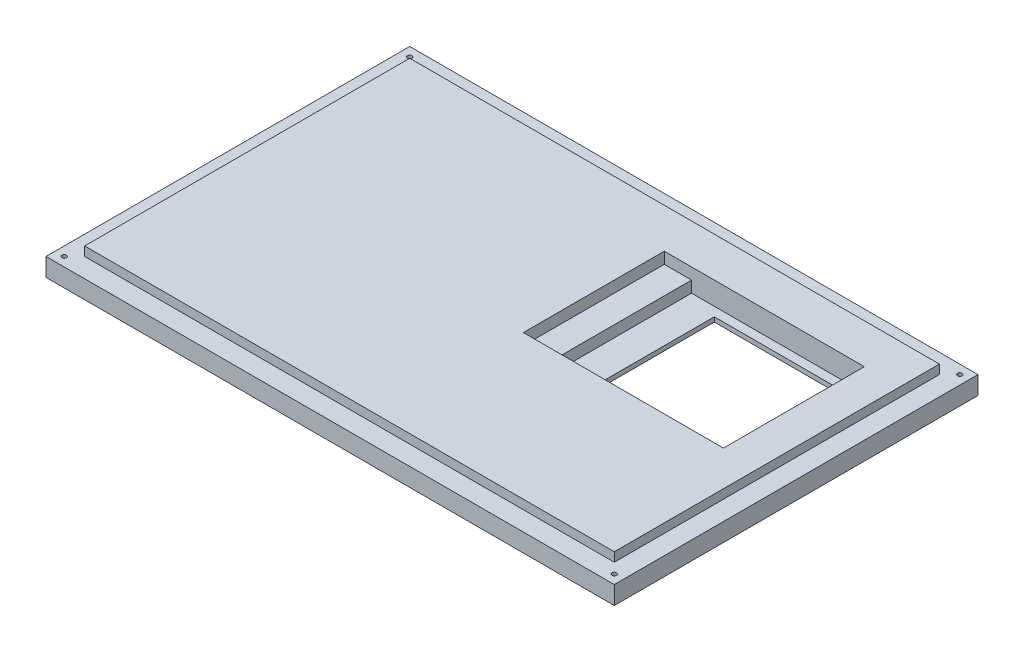
ISO-10303-21;
HEADER;
FILE_DESCRIPTION(('STEP AP214'),'2;1');
FILE_NAME('part.step','',(''),(''),'','','');
FILE_SCHEMA(('AUTOMOTIVE_DESIGN { 1 0 10303 214 1 1 1 1 }'));
ENDSEC;
DATA;
#1=APPLICATION_CONTEXT('core data for automotive mechanical design processes');
#2=APPLICATION_PROTOCOL_DEFINITION('international standard','automotive_design',2000,#1);
#3=PRODUCT_CONTEXT('',#1,'mechanical');
#4=PRODUCT('Part','Part','',(#3));
#5=PRODUCT_RELATED_PRODUCT_CATEGORY('part','',(#4));
#6=PRODUCT_DEFINITION_FORMATION('','',#4);
#7=PRODUCT_DEFINITION_CONTEXT('part definition',#1,'design');
#8=PRODUCT_DEFINITION('design','',#6,#7);
#9=PRODUCT_DEFINITION_SHAPE('','',#8);
#10=(LENGTH_UNIT() NAMED_UNIT(*) SI_UNIT(.MILLI.,.METRE.));
#11=(NAMED_UNIT(*) PLANE_ANGLE_UNIT() SI_UNIT($,.RADIAN.));
#12=(NAMED_UNIT(*) SI_UNIT($,.STERADIAN.) SOLID_ANGLE_UNIT());
#13=UNCERTAINTY_MEASURE_WITH_UNIT(LENGTH_MEASURE(1.E-05),#10,'distance_accuracy_value','');
#14=(GEOMETRIC_REPRESENTATION_CONTEXT(3) GLOBAL_UNCERTAINTY_ASSIGNED_CONTEXT((#13)) GLOBAL_UNIT_ASSIGNED_CONTEXT((#10,
#11,#12)) REPRESENTATION_CONTEXT('',''));
#15=CARTESIAN_POINT('',(0.,0.,0.));
#16=DIRECTION('',(0.,0.,1.));
#17=DIRECTION('',(1.,0.,0.));
#18=AXIS2_PLACEMENT_3D('',#15,#16,#17);
#19=CARTESIAN_POINT('',(82.,-6.,-65.));
#20=DIRECTION('',(-1.,0.,0.));
#21=DIRECTION('',(0.,0.,1.));
#22=AXIS2_PLACEMENT_3D('',#19,#20,#21);
#23=PLANE('',#22);
#24=DIRECTION('',(0.,1.,0.));
#25=VECTOR('',#24,1.);
#26=CARTESIAN_POINT('',(82.,-6.,-65.));
#27=LINE('',#26,#25);
#28=CARTESIAN_POINT('',(82.,0.,-65.));
#29=VERTEX_POINT('',#28);
#30=CARTESIAN_POINT('',(82.,1.,-65.));
#31=VERTEX_POINT('',#30);
#32=EDGE_CURVE('E233',#29,#31,#27,.T.);
#33=ORIENTED_EDGE('',*,*,#32,.T.);
#34=DIRECTION('',(0.,0.,1.));
#35=VECTOR('',#34,1.);
#36=CARTESIAN_POINT('',(82.,1.,-65.));
#37=LINE('',#36,#35);
#38=CARTESIAN_POINT('',(82.,1.,-38.));
#39=VERTEX_POINT('',#38);
#40=EDGE_CURVE('E211',#31,#39,#37,.T.);
#41=ORIENTED_EDGE('',*,*,#40,.T.);
#42=DIRECTION('',(0.,1.,0.));
#43=VECTOR('',#42,1.);
#44=CARTESIAN_POINT('',(82.,-6.,-38.));
#45=LINE('',#44,#43);
#46=CARTESIAN_POINT('',(82.,0.,-38.));
#47=VERTEX_POINT('',#46);
#48=EDGE_CURVE('E229',#47,#39,#45,.T.);
#49=ORIENTED_EDGE('',*,*,#48,.F.);
#50=DIRECTION('',(0.,0.,-1.));
#51=VECTOR('',#50,1.);
#52=CARTESIAN_POINT('',(82.,0.,0.));
#53=LINE('',#52,#51);
#54=EDGE_CURVE('E251',#47,#29,#53,.T.);
#55=ORIENTED_EDGE('',*,*,#54,.T.);
#56=EDGE_LOOP('',(#33,#41,#49,#55));
#57=FACE_BOUND('',#56,.T.);
#58=ADVANCED_FACE('F40',(#57),#23,.F.);
#59=CARTESIAN_POINT('',(82.,-6.,-65.));
#60=DIRECTION('',(0.,0.,-1.));
#61=DIRECTION('',(-1.,0.,0.));
#62=AXIS2_PLACEMENT_3D('',#59,#60,#61);
#63=PLANE('',#62);
#64=DIRECTION('',(0.,1.,0.));
#65=VECTOR('',#64,1.);
#66=CARTESIAN_POINT('',(110.,-6.,-65.));
#67=LINE('',#66,#65);
#68=CARTESIAN_POINT('',(110.,0.,-65.));
#69=VERTEX_POINT('',#68);
#70=CARTESIAN_POINT('',(110.,1.,-65.));
#71=VERTEX_POINT('',#70);
#72=EDGE_CURVE('E237',#69,#71,#67,.T.);
#73=ORIENTED_EDGE('',*,*,#72,.T.);
#74=DIRECTION('',(-1.,0.,0.));
#75=VECTOR('',#74,1.);
#76=CARTESIAN_POINT('',(82.,1.,-65.));
#77=LINE('',#76,#75);
#78=EDGE_CURVE('E208',#71,#31,#77,.T.);
#79=ORIENTED_EDGE('',*,*,#78,.T.);
#80=ORIENTED_EDGE('',*,*,#32,.F.);
#81=DIRECTION('',(1.,0.,0.));
#82=VECTOR('',#81,1.);
#83=CARTESIAN_POINT('',(0.,0.,-65.));
#84=LINE('',#83,#82);
#85=EDGE_CURVE('E249',#29,#69,#84,.T.);
#86=ORIENTED_EDGE('',*,*,#85,.T.);
#87=EDGE_LOOP('',(#73,#79,#80,#86));
#88=FACE_BOUND('',#87,.T.);
#89=ADVANCED_FACE('F365',(#88),#63,.F.);
#90=CARTESIAN_POINT('',(110.,-6.,-65.));
#91=DIRECTION('',(1.,0.,0.));
#92=DIRECTION('',(0.,0.,-1.));
#93=AXIS2_PLACEMENT_3D('',#90,#91,#92);
#94=PLANE('',#93);
#95=DIRECTION('',(0.,1.,0.));
#96=VECTOR('',#95,1.);
#97=CARTESIAN_POINT('',(110.,-6.,-38.));
#98=LINE('',#97,#96);
#99=CARTESIAN_POINT('',(110.,0.,-38.));
#100=VERTEX_POINT('',#99);
#101=CARTESIAN_POINT('',(110.,1.,-38.));
#102=VERTEX_POINT('',#101);
#103=EDGE_CURVE('E240',#100,#102,#98,.T.);
#104=ORIENTED_EDGE('',*,*,#103,.T.);
#105=DIRECTION('',(0.,0.,-1.));
#106=VECTOR('',#105,1.);
#107=CARTESIAN_POINT('',(110.,1.,-65.));
#108=LINE('',#107,#106);
#109=EDGE_CURVE('E55',#102,#71,#108,.T.);
#110=ORIENTED_EDGE('',*,*,#109,.T.);
#111=ORIENTED_EDGE('',*,*,#72,.F.);
#112=DIRECTION('',(0.,0.,1.));
#113=VECTOR('',#112,1.);
#114=CARTESIAN_POINT('',(110.,0.,0.));
#115=LINE('',#114,#113);
#116=EDGE_CURVE('E246',#69,#100,#115,.T.);
#117=ORIENTED_EDGE('',*,*,#116,.T.);
#118=EDGE_LOOP('',(#104,#110,#111,#117));
#119=FACE_BOUND('',#118,.T.);
#120=ADVANCED_FACE('F371',(#119),#94,.F.);
#121=CARTESIAN_POINT('',(82.,-6.,-38.));
#122=DIRECTION('',(0.,0.,1.));
#123=DIRECTION('',(1.,0.,0.));
#124=AXIS2_PLACEMENT_3D('',#121,#122,#123);
#125=PLANE('',#124);
#126=ORIENTED_EDGE('',*,*,#48,.T.);
#127=DIRECTION('',(1.,0.,0.));
#128=VECTOR('',#127,1.);
#129=CARTESIAN_POINT('',(82.,1.,-38.));
#130=LINE('',#129,#128);
#131=EDGE_CURVE('E12',#39,#102,#130,.T.);
#132=ORIENTED_EDGE('',*,*,#131,.T.);
#133=ORIENTED_EDGE('',*,*,#103,.F.);
#134=DIRECTION('',(-1.,0.,0.));
#135=VECTOR('',#134,1.);
#136=CARTESIAN_POINT('',(0.,0.,-38.));
#137=LINE('',#136,#135);
#138=EDGE_CURVE('E236',#100,#47,#137,.T.);
#139=ORIENTED_EDGE('',*,*,#138,.T.);
#140=EDGE_LOOP('',(#126,#132,#133,#139));
#141=FACE_BOUND('',#140,.T.);
#142=ADVANCED_FACE('F336',(#141),#125,.F.);
#143=CARTESIAN_POINT('',(0.,4.,0.));
#144=DIRECTION('',(0.,-1.,0.));
#145=DIRECTION('',(0.,0.,-1.));
#146=AXIS2_PLACEMENT_3D('',#143,#144,#145);
#147=PLANE('',#146);
#148=CARTESIAN_POINT('',(123.,4.,-78.));
#149=DIRECTION('',(0.,-1.,0.));
#150=DIRECTION('',(0.,0.,-1.));
#151=AXIS2_PLACEMENT_3D('',#148,#149,#150);
#152=CIRCLE('',#151,0.5);
#153=CARTESIAN_POINT('',(123.,4.,-78.5));
#154=VERTEX_POINT('',#153);
#155=EDGE_CURVE('E676',#154,#154,#152,.T.);
#156=ORIENTED_EDGE('',*,*,#155,.T.);
#157=EDGE_LOOP('',(#156));
#158=FACE_BOUND('',#157,.T.);
#159=CARTESIAN_POINT('',(123.,4.,-2.));
#160=DIRECTION('',(0.,-1.,0.));
#161=DIRECTION('',(0.,0.,-1.));
#162=AXIS2_PLACEMENT_3D('',#159,#160,#161);
#163=CIRCLE('',#162,0.5);
#164=CARTESIAN_POINT('',(123.,4.,-2.5));
#165=VERTEX_POINT('',#164);
#166=EDGE_CURVE('E672',#165,#165,#163,.T.);
#167=ORIENTED_EDGE('',*,*,#166,.T.);
#168=EDGE_LOOP('',(#167));
#169=FACE_BOUND('',#168,.T.);
#170=CARTESIAN_POINT('',(2.,4.,-2.));
#171=DIRECTION('',(0.,-1.,0.));
#172=DIRECTION('',(0.,0.,-1.));
#173=AXIS2_PLACEMENT_3D('',#170,#171,#172);
#174=CIRCLE('',#173,0.499999999999999);
#175=CARTESIAN_POINT('',(2.,4.,-2.5));
#176=VERTEX_POINT('',#175);
#177=EDGE_CURVE('E667',#176,#176,#174,.T.);
#178=ORIENTED_EDGE('',*,*,#177,.T.);
#179=EDGE_LOOP('',(#178));
#180=FACE_BOUND('',#179,.T.);
#181=CARTESIAN_POINT('',(2.,4.,-78.));
#182=DIRECTION('',(0.,-1.,0.));
#183=DIRECTION('',(0.,0.,-1.));
#184=AXIS2_PLACEMENT_3D('',#181,#182,#183);
#185=CIRCLE('',#184,0.499999999999999);
#186=CARTESIAN_POINT('',(2.,4.,-78.5));
#187=VERTEX_POINT('',#186);
#188=EDGE_CURVE('E192',#187,#187,#185,.T.);
#189=ORIENTED_EDGE('',*,*,#188,.T.);
#190=EDGE_LOOP('',(#189));
#191=FACE_BOUND('',#190,.T.);
#192=DIRECTION('',(0.,0.,1.));
#193=VECTOR('',#192,1.);
#194=CARTESIAN_POINT('',(0.,4.,0.));
#195=LINE('',#194,#193);
#196=CARTESIAN_POINT('',(0.,4.,-80.));
#197=VERTEX_POINT('',#196);
#198=CARTESIAN_POINT('',(0.,4.,0.));
#199=VERTEX_POINT('',#198);
#200=EDGE_CURVE('E287',#197,#199,#195,.T.);
#201=ORIENTED_EDGE('',*,*,#200,.T.);
#202=DIRECTION('',(1.,0.,0.));
#203=VECTOR('',#202,1.);
#204=CARTESIAN_POINT('',(0.,4.,0.));
#205=LINE('',#204,#203);
#206=CARTESIAN_POINT('',(125.,4.,0.));
#207=VERTEX_POINT('',#206);
#208=EDGE_CURVE('E290',#199,#207,#205,.T.);
#209=ORIENTED_EDGE('',*,*,#208,.T.);
#210=DIRECTION('',(0.,0.,-1.));
#211=VECTOR('',#210,1.);
#212=CARTESIAN_POINT('',(125.,4.,0.));
#213=LINE('',#212,#211);
#214=CARTESIAN_POINT('',(125.,4.,-80.));
#215=VERTEX_POINT('',#214);
#216=EDGE_CURVE('E293',#207,#215,#213,.T.);
#217=ORIENTED_EDGE('',*,*,#216,.T.);
#218=DIRECTION('',(-1.,0.,0.));
#219=VECTOR('',#218,1.);
#220=CARTESIAN_POINT('',(0.,4.,-80.));
#221=LINE('',#220,#219);
#222=EDGE_CURVE('E295',#215,#197,#221,.T.);
#223=ORIENTED_EDGE('',*,*,#222,.T.);
#224=EDGE_LOOP('',(#201,#209,#217,#223));
#225=FACE_BOUND('',#224,.T.);
#226=DIRECTION('',(0.,0.,1.));
#227=VECTOR('',#226,1.);
#228=CARTESIAN_POINT('',(4.25,4.,-75.75));
#229=LINE('',#228,#227);
#230=CARTESIAN_POINT('',(4.25,4.,-75.75));
#231=VERTEX_POINT('',#230);
#232=CARTESIAN_POINT('',(4.25000000000001,4.,-4.25));
#233=VERTEX_POINT('',#232);
#234=EDGE_CURVE('E253',#231,#233,#229,.T.);
#235=ORIENTED_EDGE('',*,*,#234,.F.);
#236=DIRECTION('',(-1.,0.,0.));
#237=VECTOR('',#236,1.);
#238=CARTESIAN_POINT('',(4.25,4.,-75.75));
#239=LINE('',#238,#237);
#240=CARTESIAN_POINT('',(120.75,4.,-75.75));
#241=VERTEX_POINT('',#240);
#242=EDGE_CURVE('E258',#241,#231,#239,.T.);
#243=ORIENTED_EDGE('',*,*,#242,.F.);
#244=DIRECTION('',(0.,0.,-1.));
#245=VECTOR('',#244,1.);
#246=CARTESIAN_POINT('',(120.75,4.,-75.75));
#247=LINE('',#246,#245);
#248=CARTESIAN_POINT('',(120.75,4.,-4.25));
#249=VERTEX_POINT('',#248);
#250=EDGE_CURVE('E270',#249,#241,#247,.T.);
#251=ORIENTED_EDGE('',*,*,#250,.F.);
#252=DIRECTION('',(1.,0.,0.));
#253=VECTOR('',#252,1.);
#254=CARTESIAN_POINT('',(4.25000000000001,4.,-4.25));
#255=LINE('',#254,#253);
#256=EDGE_CURVE('E267',#233,#249,#255,.T.);
#257=ORIENTED_EDGE('',*,*,#256,.F.);
#258=EDGE_LOOP('',(#235,#243,#251,#257));
#259=FACE_BOUND('',#258,.T.);
#260=ADVANCED_FACE('F333',(#158,#169,#180,#191,#225,#259),#147,.F.);
#261=CARTESIAN_POINT('',(0.,4.,0.));
#262=DIRECTION('',(1.,0.,0.));
#263=DIRECTION('',(0.,0.,-1.));
#264=AXIS2_PLACEMENT_3D('',#261,#262,#263);
#265=PLANE('',#264);
#266=DIRECTION('',(0.,0.,1.));
#267=VECTOR('',#266,1.);
#268=CARTESIAN_POINT('',(0.,0.,0.));
#269=LINE('',#268,#267);
#270=CARTESIAN_POINT('',(0.,0.,-80.));
#271=VERTEX_POINT('',#270);
#272=CARTESIAN_POINT('',(0.,0.,0.));
#273=VERTEX_POINT('',#272);
#274=EDGE_CURVE('E286',#271,#273,#269,.T.);
#275=ORIENTED_EDGE('',*,*,#274,.T.);
#276=DIRECTION('',(0.,-1.,0.));
#277=VECTOR('',#276,1.);
#278=CARTESIAN_POINT('',(0.,4.,0.));
#279=LINE('',#278,#277);
#280=EDGE_CURVE('E48',#199,#273,#279,.T.);
#281=ORIENTED_EDGE('',*,*,#280,.F.);
#282=ORIENTED_EDGE('',*,*,#200,.F.);
#283=DIRECTION('',(0.,-1.,0.));
#284=VECTOR('',#283,1.);
#285=CARTESIAN_POINT('',(0.,4.,-80.));
#286=LINE('',#285,#284);
#287=EDGE_CURVE('E297',#197,#271,#286,.T.);
#288=ORIENTED_EDGE('',*,*,#287,.T.);
#289=EDGE_LOOP('',(#275,#281,#282,#288));
#290=FACE_BOUND('',#289,.T.);
#291=ADVANCED_FACE('F42',(#290),#265,.F.);
#292=CARTESIAN_POINT('',(0.,4.,0.));
#293=DIRECTION('',(0.,0.,-1.));
#294=DIRECTION('',(-1.,0.,0.));
#295=AXIS2_PLACEMENT_3D('',#292,#293,#294);
#296=PLANE('',#295);
#297=DIRECTION('',(1.,0.,0.));
#298=VECTOR('',#297,1.);
#299=CARTESIAN_POINT('',(0.,0.,0.));
#300=LINE('',#299,#298);
#301=CARTESIAN_POINT('',(125.,0.,0.));
#302=VERTEX_POINT('',#301);
#303=EDGE_CURVE('E300',#273,#302,#300,.T.);
#304=ORIENTED_EDGE('',*,*,#303,.T.);
#305=DIRECTION('',(0.,-1.,0.));
#306=VECTOR('',#305,1.);
#307=CARTESIAN_POINT('',(125.,4.,0.));
#308=LINE('',#307,#306);
#309=EDGE_CURVE('E310',#207,#302,#308,.T.);
#310=ORIENTED_EDGE('',*,*,#309,.F.);
#311=ORIENTED_EDGE('',*,*,#208,.F.);
#312=ORIENTED_EDGE('',*,*,#280,.T.);
#313=EDGE_LOOP('',(#304,#310,#311,#312));
#314=FACE_BOUND('',#313,.T.);
#315=ADVANCED_FACE('F315',(#314),#296,.F.);
#316=CARTESIAN_POINT('',(125.,4.,0.));
#317=DIRECTION('',(-1.,0.,0.));
#318=DIRECTION('',(0.,0.,1.));
#319=AXIS2_PLACEMENT_3D('',#316,#317,#318);
#320=PLANE('',#319);
#321=DIRECTION('',(0.,0.,-1.));
#322=VECTOR('',#321,1.);
#323=CARTESIAN_POINT('',(125.,0.,0.));
#324=LINE('',#323,#322);
#325=CARTESIAN_POINT('',(125.,0.,-80.));
#326=VERTEX_POINT('',#325);
#327=EDGE_CURVE('E302',#302,#326,#324,.T.);
#328=ORIENTED_EDGE('',*,*,#327,.T.);
#329=DIRECTION('',(0.,-1.,0.));
#330=VECTOR('',#329,1.);
#331=CARTESIAN_POINT('',(125.,4.,-80.));
#332=LINE('',#331,#330);
#333=EDGE_CURVE('E307',#215,#326,#332,.T.);
#334=ORIENTED_EDGE('',*,*,#333,.F.);
#335=ORIENTED_EDGE('',*,*,#216,.F.);
#336=ORIENTED_EDGE('',*,*,#309,.T.);
#337=EDGE_LOOP('',(#328,#334,#335,#336));
#338=FACE_BOUND('',#337,.T.);
#339=ADVANCED_FACE('F327',(#338),#320,.F.);
#340=CARTESIAN_POINT('',(0.,4.,-80.));
#341=DIRECTION('',(0.,0.,1.));
#342=DIRECTION('',(1.,0.,0.));
#343=AXIS2_PLACEMENT_3D('',#340,#341,#342);
#344=PLANE('',#343);
#345=DIRECTION('',(-1.,0.,0.));
#346=VECTOR('',#345,1.);
#347=CARTESIAN_POINT('',(0.,0.,-80.));
#348=LINE('',#347,#346);
#349=EDGE_CURVE('E291',#326,#271,#348,.T.);
#350=ORIENTED_EDGE('',*,*,#349,.T.);
#351=ORIENTED_EDGE('',*,*,#287,.F.);
#352=ORIENTED_EDGE('',*,*,#222,.F.);
#353=ORIENTED_EDGE('',*,*,#333,.T.);
#354=EDGE_LOOP('',(#350,#351,#352,#353));
#355=FACE_BOUND('',#354,.T.);
#356=ADVANCED_FACE('F331',(#355),#344,.F.);
#357=CARTESIAN_POINT('',(0.,0.,0.));
#358=DIRECTION('',(0.,-1.,0.));
#359=DIRECTION('',(0.,0.,-1.));
#360=AXIS2_PLACEMENT_3D('',#357,#358,#359);
#361=PLANE('',#360);
#362=CARTESIAN_POINT('',(123.,0.,-78.));
#363=DIRECTION('',(0.,-1.,0.));
#364=DIRECTION('',(0.,0.,-1.));
#365=AXIS2_PLACEMENT_3D('',#362,#363,#364);
#366=CIRCLE('',#365,0.5);
#367=CARTESIAN_POINT('',(123.,0.,-78.5));
#368=VERTEX_POINT('',#367);
#369=EDGE_CURVE('E647',#368,#368,#366,.T.);
#370=ORIENTED_EDGE('',*,*,#369,.F.);
#371=EDGE_LOOP('',(#370));
#372=FACE_BOUND('',#371,.T.);
#373=CARTESIAN_POINT('',(123.,0.,-2.));
#374=DIRECTION('',(0.,-1.,0.));
#375=DIRECTION('',(0.,0.,-1.));
#376=AXIS2_PLACEMENT_3D('',#373,#374,#375);
#377=CIRCLE('',#376,0.5);
#378=CARTESIAN_POINT('',(123.,0.,-2.5));
#379=VERTEX_POINT('',#378);
#380=EDGE_CURVE('E651',#379,#379,#377,.T.);
#381=ORIENTED_EDGE('',*,*,#380,.F.);
#382=EDGE_LOOP('',(#381));
#383=FACE_BOUND('',#382,.T.);
#384=CARTESIAN_POINT('',(2.,0.,-2.));
#385=DIRECTION('',(0.,-1.,0.));
#386=DIRECTION('',(0.,0.,-1.));
#387=AXIS2_PLACEMENT_3D('',#384,#385,#386);
#388=CIRCLE('',#387,0.5);
#389=CARTESIAN_POINT('',(2.,0.,-2.5));
#390=VERTEX_POINT('',#389);
#391=EDGE_CURVE('E655',#390,#390,#388,.T.);
#392=ORIENTED_EDGE('',*,*,#391,.F.);
#393=EDGE_LOOP('',(#392));
#394=FACE_BOUND('',#393,.T.);
#395=CARTESIAN_POINT('',(2.,0.,-78.));
#396=DIRECTION('',(0.,-1.,0.));
#397=DIRECTION('',(0.,0.,-1.));
#398=AXIS2_PLACEMENT_3D('',#395,#396,#397);
#399=CIRCLE('',#398,0.5);
#400=CARTESIAN_POINT('',(2.,0.,-78.5));
#401=VERTEX_POINT('',#400);
#402=EDGE_CURVE('E195',#401,#401,#399,.T.);
#403=ORIENTED_EDGE('',*,*,#402,.F.);
#404=EDGE_LOOP('',(#403));
#405=FACE_BOUND('',#404,.T.);
#406=ORIENTED_EDGE('',*,*,#54,.F.);
#407=ORIENTED_EDGE('',*,*,#138,.F.);
#408=ORIENTED_EDGE('',*,*,#116,.F.);
#409=ORIENTED_EDGE('',*,*,#85,.F.);
#410=EDGE_LOOP('',(#406,#407,#408,#409));
#411=FACE_BOUND('',#410,.T.);
#412=ORIENTED_EDGE('',*,*,#274,.F.);
#413=ORIENTED_EDGE('',*,*,#349,.F.);
#414=ORIENTED_EDGE('',*,*,#327,.F.);
#415=ORIENTED_EDGE('',*,*,#303,.F.);
#416=EDGE_LOOP('',(#412,#413,#414,#415));
#417=FACE_BOUND('',#416,.T.);
#418=ADVANCED_FACE('F323',(#372,#383,#394,#405,#411,#417),#361,.T.);
#419=CARTESIAN_POINT('',(4.25,6.,-75.75));
#420=DIRECTION('',(1.,0.,0.));
#421=DIRECTION('',(0.,0.,-1.));
#422=AXIS2_PLACEMENT_3D('',#419,#420,#421);
#423=PLANE('',#422);
#424=ORIENTED_EDGE('',*,*,#234,.T.);
#425=DIRECTION('',(0.,-1.,0.));
#426=VECTOR('',#425,1.);
#427=CARTESIAN_POINT('',(4.25000000000001,6.,-4.25));
#428=LINE('',#427,#426);
#429=CARTESIAN_POINT('',(4.25000000000001,6.,-4.25));
#430=VERTEX_POINT('',#429);
#431=EDGE_CURVE('E283',#430,#233,#428,.T.);
#432=ORIENTED_EDGE('',*,*,#431,.F.);
#433=DIRECTION('',(0.,0.,1.));
#434=VECTOR('',#433,1.);
#435=CARTESIAN_POINT('',(4.25,6.,-75.75));
#436=LINE('',#435,#434);
#437=CARTESIAN_POINT('',(4.25,6.,-75.75));
#438=VERTEX_POINT('',#437);
#439=EDGE_CURVE('E254',#438,#430,#436,.T.);
#440=ORIENTED_EDGE('',*,*,#439,.F.);
#441=DIRECTION('',(0.,-1.,0.));
#442=VECTOR('',#441,1.);
#443=CARTESIAN_POINT('',(4.25,6.,-75.75));
#444=LINE('',#443,#442);
#445=EDGE_CURVE('E264',#438,#231,#444,.T.);
#446=ORIENTED_EDGE('',*,*,#445,.T.);
#447=EDGE_LOOP('',(#424,#432,#440,#446));
#448=FACE_BOUND('',#447,.T.);
#449=ADVANCED_FACE('F347',(#448),#423,.F.);
#450=CARTESIAN_POINT('',(4.25000000000001,6.,-4.25));
#451=DIRECTION('',(0.,0.,-1.));
#452=DIRECTION('',(-1.,0.,0.));
#453=AXIS2_PLACEMENT_3D('',#450,#451,#452);
#454=PLANE('',#453);
#455=ORIENTED_EDGE('',*,*,#256,.T.);
#456=DIRECTION('',(0.,-1.,0.));
#457=VECTOR('',#456,1.);
#458=CARTESIAN_POINT('',(120.75,6.,-4.25));
#459=LINE('',#458,#457);
#460=CARTESIAN_POINT('',(120.75,6.,-4.25));
#461=VERTEX_POINT('',#460);
#462=EDGE_CURVE('E280',#461,#249,#459,.T.);
#463=ORIENTED_EDGE('',*,*,#462,.F.);
#464=DIRECTION('',(1.,0.,0.));
#465=VECTOR('',#464,1.);
#466=CARTESIAN_POINT('',(4.25000000000001,6.,-4.25));
#467=LINE('',#466,#465);
#468=EDGE_CURVE('E257',#430,#461,#467,.T.);
#469=ORIENTED_EDGE('',*,*,#468,.F.);
#470=ORIENTED_EDGE('',*,*,#431,.T.);
#471=EDGE_LOOP('',(#455,#463,#469,#470));
#472=FACE_BOUND('',#471,.T.);
#473=ADVANCED_FACE('F355',(#472),#454,.F.);
#474=CARTESIAN_POINT('',(120.75,6.,-75.75));
#475=DIRECTION('',(-1.,0.,0.));
#476=DIRECTION('',(0.,0.,1.));
#477=AXIS2_PLACEMENT_3D('',#474,#475,#476);
#478=PLANE('',#477);
#479=ORIENTED_EDGE('',*,*,#250,.T.);
#480=DIRECTION('',(0.,-1.,0.));
#481=VECTOR('',#480,1.);
#482=CARTESIAN_POINT('',(120.75,6.,-75.75));
#483=LINE('',#482,#481);
#484=CARTESIAN_POINT('',(120.75,6.,-75.75));
#485=VERTEX_POINT('',#484);
#486=EDGE_CURVE('E277',#485,#241,#483,.T.);
#487=ORIENTED_EDGE('',*,*,#486,.F.);
#488=DIRECTION('',(0.,0.,-1.));
#489=VECTOR('',#488,1.);
#490=CARTESIAN_POINT('',(120.75,6.,-75.75));
#491=LINE('',#490,#489);
#492=EDGE_CURVE('E260',#461,#485,#491,.T.);
#493=ORIENTED_EDGE('',*,*,#492,.F.);
#494=ORIENTED_EDGE('',*,*,#462,.T.);
#495=EDGE_LOOP('',(#479,#487,#493,#494));
#496=FACE_BOUND('',#495,.T.);
#497=ADVANCED_FACE('F353',(#496),#478,.F.);
#498=CARTESIAN_POINT('',(4.25,6.,-75.75));
#499=DIRECTION('',(0.,0.,1.));
#500=DIRECTION('',(1.,0.,0.));
#501=AXIS2_PLACEMENT_3D('',#498,#499,#500);
#502=PLANE('',#501);
#503=ORIENTED_EDGE('',*,*,#242,.T.);
#504=ORIENTED_EDGE('',*,*,#445,.F.);
#505=DIRECTION('',(-1.,0.,0.));
#506=VECTOR('',#505,1.);
#507=CARTESIAN_POINT('',(4.25,6.,-75.75));
#508=LINE('',#507,#506);
#509=EDGE_CURVE('E262',#485,#438,#508,.T.);
#510=ORIENTED_EDGE('',*,*,#509,.F.);
#511=ORIENTED_EDGE('',*,*,#486,.T.);
#512=EDGE_LOOP('',(#503,#504,#510,#511));
#513=FACE_BOUND('',#512,.T.);
#514=ADVANCED_FACE('F343',(#513),#502,.F.);
#515=CARTESIAN_POINT('',(0.,6.,0.));
#516=DIRECTION('',(0.,1.,0.));
#517=DIRECTION('',(0.,0.,1.));
#518=AXIS2_PLACEMENT_3D('',#515,#516,#517);
#519=PLANE('',#518);
#520=DIRECTION('',(0.,0.,1.));
#521=VECTOR('',#520,1.);
#522=CARTESIAN_POINT('',(69.,6.,-67.));
#523=LINE('',#522,#521);
#524=CARTESIAN_POINT('',(69.,6.,-67.));
#525=VERTEX_POINT('',#524);
#526=CARTESIAN_POINT('',(69.,6.,-36.));
#527=VERTEX_POINT('',#526);
#528=EDGE_CURVE('E62',#525,#527,#523,.T.);
#529=ORIENTED_EDGE('',*,*,#528,.F.);
#530=DIRECTION('',(-1.,0.,0.));
#531=VECTOR('',#530,1.);
#532=CARTESIAN_POINT('',(69.,6.,-67.));
#533=LINE('',#532,#531);
#534=CARTESIAN_POINT('',(113.,6.,-67.));
#535=VERTEX_POINT('',#534);
#536=EDGE_CURVE('E218',#535,#525,#533,.T.);
#537=ORIENTED_EDGE('',*,*,#536,.F.);
#538=DIRECTION('',(0.,0.,-1.));
#539=VECTOR('',#538,1.);
#540=CARTESIAN_POINT('',(113.,6.,-67.));
#541=LINE('',#540,#539);
#542=CARTESIAN_POINT('',(113.,6.,-36.));
#543=VERTEX_POINT('',#542);
#544=EDGE_CURVE('E173',#543,#535,#541,.T.);
#545=ORIENTED_EDGE('',*,*,#544,.F.);
#546=DIRECTION('',(1.,0.,0.));
#547=VECTOR('',#546,1.);
#548=CARTESIAN_POINT('',(69.,6.,-36.));
#549=LINE('',#548,#547);
#550=EDGE_CURVE('E225',#527,#543,#549,.T.);
#551=ORIENTED_EDGE('',*,*,#550,.F.);
#552=EDGE_LOOP('',(#529,#537,#545,#551));
#553=FACE_BOUND('',#552,.T.);
#554=ORIENTED_EDGE('',*,*,#439,.T.);
#555=ORIENTED_EDGE('',*,*,#468,.T.);
#556=ORIENTED_EDGE('',*,*,#492,.T.);
#557=ORIENTED_EDGE('',*,*,#509,.T.);
#558=EDGE_LOOP('',(#554,#555,#556,#557));
#559=FACE_BOUND('',#558,.T.);
#560=ADVANCED_FACE('F349',(#553,#559),#519,.T.);
#561=CARTESIAN_POINT('',(0.,3.5,0.));
#562=DIRECTION('',(0.,1.,0.));
#563=DIRECTION('',(0.,0.,1.));
#564=AXIS2_PLACEMENT_3D('',#561,#562,#563);
#565=PLANE('',#564);
#566=DIRECTION('',(0.,0.,1.));
#567=VECTOR('',#566,1.);
#568=CARTESIAN_POINT('',(75.,3.5,0.));
#569=LINE('',#568,#567);
#570=CARTESIAN_POINT('',(75.,3.5,-67.));
#571=VERTEX_POINT('',#570);
#572=CARTESIAN_POINT('',(75.,3.5,-36.));
#573=VERTEX_POINT('',#572);
#574=EDGE_CURVE('E204',#571,#573,#569,.T.);
#575=ORIENTED_EDGE('',*,*,#574,.F.);
#576=DIRECTION('',(-1.,0.,0.));
#577=VECTOR('',#576,1.);
#578=CARTESIAN_POINT('',(69.,3.5,-67.));
#579=LINE('',#578,#577);
#580=CARTESIAN_POINT('',(69.,3.5,-67.));
#581=VERTEX_POINT('',#580);
#582=EDGE_CURVE('E221',#571,#581,#579,.T.);
#583=ORIENTED_EDGE('',*,*,#582,.T.);
#584=DIRECTION('',(0.,0.,1.));
#585=VECTOR('',#584,1.);
#586=CARTESIAN_POINT('',(69.,3.5,-67.));
#587=LINE('',#586,#585);
#588=CARTESIAN_POINT('',(69.,3.5,-36.));
#589=VERTEX_POINT('',#588);
#590=EDGE_CURVE('E214',#581,#589,#587,.T.);
#591=ORIENTED_EDGE('',*,*,#590,.T.);
#592=DIRECTION('',(1.,0.,0.));
#593=VECTOR('',#592,1.);
#594=CARTESIAN_POINT('',(69.,3.5,-36.));
#595=LINE('',#594,#593);
#596=EDGE_CURVE('E217',#589,#573,#595,.T.);
#597=ORIENTED_EDGE('',*,*,#596,.T.);
#598=EDGE_LOOP('',(#575,#583,#591,#597));
#599=FACE_BOUND('',#598,.T.);
#600=ADVANCED_FACE('F379',(#599),#565,.T.);
#601=CARTESIAN_POINT('',(69.,3.5,-67.));
#602=DIRECTION('',(-1.,0.,0.));
#603=DIRECTION('',(0.,0.,1.));
#604=AXIS2_PLACEMENT_3D('',#601,#602,#603);
#605=PLANE('',#604);
#606=ORIENTED_EDGE('',*,*,#528,.T.);
#607=DIRECTION('',(0.,1.,0.));
#608=VECTOR('',#607,1.);
#609=CARTESIAN_POINT('',(69.,3.5,-36.));
#610=LINE('',#609,#608);
#611=EDGE_CURVE('E223',#589,#527,#610,.T.);
#612=ORIENTED_EDGE('',*,*,#611,.F.);
#613=ORIENTED_EDGE('',*,*,#590,.F.);
#614=DIRECTION('',(0.,1.,0.));
#615=VECTOR('',#614,1.);
#616=CARTESIAN_POINT('',(69.,3.5,-67.));
#617=LINE('',#616,#615);
#618=EDGE_CURVE('E176',#581,#525,#617,.T.);
#619=ORIENTED_EDGE('',*,*,#618,.T.);
#620=EDGE_LOOP('',(#606,#612,#613,#619));
#621=FACE_BOUND('',#620,.T.);
#622=ADVANCED_FACE('F397',(#621),#605,.F.);
#623=CARTESIAN_POINT('',(69.,3.5,-67.));
#624=DIRECTION('',(0.,0.,-1.));
#625=DIRECTION('',(-1.,0.,0.));
#626=AXIS2_PLACEMENT_3D('',#623,#624,#625);
#627=PLANE('',#626);
#628=ORIENTED_EDGE('',*,*,#582,.F.);
#629=DIRECTION('',(0.,1.,0.));
#630=VECTOR('',#629,1.);
#631=CARTESIAN_POINT('',(75.,1.,-67.));
#632=LINE('',#631,#630);
#633=CARTESIAN_POINT('',(75.,1.,-67.));
#634=VERTEX_POINT('',#633);
#635=EDGE_CURVE('E183',#634,#571,#632,.T.);
#636=ORIENTED_EDGE('',*,*,#635,.F.);
#637=DIRECTION('',(-1.,0.,0.));
#638=VECTOR('',#637,1.);
#639=CARTESIAN_POINT('',(113.,1.,-67.));
#640=LINE('',#639,#638);
#641=CARTESIAN_POINT('',(113.,1.,-67.));
#642=VERTEX_POINT('',#641);
#643=EDGE_CURVE('E180',#642,#634,#640,.T.);
#644=ORIENTED_EDGE('',*,*,#643,.F.);
#645=DIRECTION('',(0.,1.,0.));
#646=VECTOR('',#645,1.);
#647=CARTESIAN_POINT('',(113.,3.5,-67.));
#648=LINE('',#647,#646);
#649=EDGE_CURVE('E165',#642,#535,#648,.T.);
#650=ORIENTED_EDGE('',*,*,#649,.T.);
#651=ORIENTED_EDGE('',*,*,#536,.T.);
#652=ORIENTED_EDGE('',*,*,#618,.F.);
#653=EDGE_LOOP('',(#628,#636,#644,#650,#651,#652));
#654=FACE_BOUND('',#653,.T.);
#655=ADVANCED_FACE('F182',(#654),#627,.F.);
#656=CARTESIAN_POINT('',(113.,3.5,-67.));
#657=DIRECTION('',(1.,0.,0.));
#658=DIRECTION('',(0.,0.,-1.));
#659=AXIS2_PLACEMENT_3D('',#656,#657,#658);
#660=PLANE('',#659);
#661=ORIENTED_EDGE('',*,*,#544,.T.);
#662=ORIENTED_EDGE('',*,*,#649,.F.);
#663=DIRECTION('',(0.,0.,-1.));
#664=VECTOR('',#663,1.);
#665=CARTESIAN_POINT('',(113.,1.,-67.));
#666=LINE('',#665,#664);
#667=CARTESIAN_POINT('',(113.,1.,-36.));
#668=VERTEX_POINT('',#667);
#669=EDGE_CURVE('E170',#668,#642,#666,.T.);
#670=ORIENTED_EDGE('',*,*,#669,.F.);
#671=DIRECTION('',(0.,1.,0.));
#672=VECTOR('',#671,1.);
#673=CARTESIAN_POINT('',(113.,3.5,-36.));
#674=LINE('',#673,#672);
#675=EDGE_CURVE('E177',#668,#543,#674,.T.);
#676=ORIENTED_EDGE('',*,*,#675,.T.);
#677=EDGE_LOOP('',(#661,#662,#670,#676));
#678=FACE_BOUND('',#677,.T.);
#679=ADVANCED_FACE('F167',(#678),#660,.F.);
#680=CARTESIAN_POINT('',(69.,3.5,-36.));
#681=DIRECTION('',(0.,0.,1.));
#682=DIRECTION('',(1.,0.,0.));
#683=AXIS2_PLACEMENT_3D('',#680,#681,#682);
#684=PLANE('',#683);
#685=ORIENTED_EDGE('',*,*,#550,.T.);
#686=ORIENTED_EDGE('',*,*,#675,.F.);
#687=DIRECTION('',(1.,0.,0.));
#688=VECTOR('',#687,1.);
#689=CARTESIAN_POINT('',(113.,1.,-36.));
#690=LINE('',#689,#688);
#691=CARTESIAN_POINT('',(75.,1.,-36.));
#692=VERTEX_POINT('',#691);
#693=EDGE_CURVE('E191',#692,#668,#690,.T.);
#694=ORIENTED_EDGE('',*,*,#693,.F.);
#695=DIRECTION('',(0.,1.,0.));
#696=VECTOR('',#695,1.);
#697=CARTESIAN_POINT('',(75.,1.,-36.));
#698=LINE('',#697,#696);
#699=EDGE_CURVE('E201',#692,#573,#698,.T.);
#700=ORIENTED_EDGE('',*,*,#699,.T.);
#701=ORIENTED_EDGE('',*,*,#596,.F.);
#702=ORIENTED_EDGE('',*,*,#611,.T.);
#703=EDGE_LOOP('',(#685,#686,#694,#700,#701,#702));
#704=FACE_BOUND('',#703,.T.);
#705=ADVANCED_FACE('F416',(#704),#684,.F.);
#706=CARTESIAN_POINT('',(0.,1.,0.));
#707=DIRECTION('',(0.,-1.,0.));
#708=DIRECTION('',(0.,0.,-1.));
#709=AXIS2_PLACEMENT_3D('',#706,#707,#708);
#710=PLANE('',#709);
#711=ORIENTED_EDGE('',*,*,#669,.T.);
#712=ORIENTED_EDGE('',*,*,#643,.T.);
#713=DIRECTION('',(0.,0.,1.));
#714=VECTOR('',#713,1.);
#715=CARTESIAN_POINT('',(75.,1.,-67.));
#716=LINE('',#715,#714);
#717=EDGE_CURVE('E187',#634,#692,#716,.T.);
#718=ORIENTED_EDGE('',*,*,#717,.T.);
#719=ORIENTED_EDGE('',*,*,#693,.T.);
#720=EDGE_LOOP('',(#711,#712,#718,#719));
#721=FACE_BOUND('',#720,.T.);
#722=ORIENTED_EDGE('',*,*,#78,.F.);
#723=ORIENTED_EDGE('',*,*,#109,.F.);
#724=ORIENTED_EDGE('',*,*,#131,.F.);
#725=ORIENTED_EDGE('',*,*,#40,.F.);
#726=EDGE_LOOP('',(#722,#723,#724,#725));
#727=FACE_BOUND('',#726,.T.);
#728=ADVANCED_FACE('F189',(#721,#727),#710,.F.);
#729=CARTESIAN_POINT('',(75.,1.,-67.));
#730=DIRECTION('',(-1.,0.,0.));
#731=DIRECTION('',(0.,0.,1.));
#732=AXIS2_PLACEMENT_3D('',#729,#730,#731);
#733=PLANE('',#732);
#734=ORIENTED_EDGE('',*,*,#574,.T.);
#735=ORIENTED_EDGE('',*,*,#699,.F.);
#736=ORIENTED_EDGE('',*,*,#717,.F.);
#737=ORIENTED_EDGE('',*,*,#635,.T.);
#738=EDGE_LOOP('',(#734,#735,#736,#737));
#739=FACE_BOUND('',#738,.T.);
#740=ADVANCED_FACE('F430',(#739),#733,.F.);
#741=CARTESIAN_POINT('',(2.,0.,-78.));
#742=DIRECTION('',(0.,-1.,0.));
#743=DIRECTION('',(0.,0.,-1.));
#744=AXIS2_PLACEMENT_3D('',#741,#742,#743);
#745=CYLINDRICAL_SURFACE('',#744,0.499999999999999);
#746=ORIENTED_EDGE('',*,*,#188,.F.);
#747=EDGE_LOOP('',(#746));
#748=FACE_BOUND('',#747,.T.);
#749=ORIENTED_EDGE('',*,*,#402,.T.);
#750=EDGE_LOOP('',(#749));
#751=FACE_BOUND('',#750,.T.);
#752=ADVANCED_FACE('F437',(#748,#751),#745,.F.);
#753=CARTESIAN_POINT('',(2.,0.,-2.));
#754=DIRECTION('',(0.,-1.,0.));
#755=DIRECTION('',(0.,0.,-1.));
#756=AXIS2_PLACEMENT_3D('',#753,#754,#755);
#757=CYLINDRICAL_SURFACE('',#756,0.499999999999999);
#758=ORIENTED_EDGE('',*,*,#177,.F.);
#759=EDGE_LOOP('',(#758));
#760=FACE_BOUND('',#759,.T.);
#761=ORIENTED_EDGE('',*,*,#391,.T.);
#762=EDGE_LOOP('',(#761));
#763=FACE_BOUND('',#762,.T.);
#764=ADVANCED_FACE('F446',(#760,#763),#757,.F.);
#765=CARTESIAN_POINT('',(123.,0.,-2.));
#766=DIRECTION('',(0.,-1.,0.));
#767=DIRECTION('',(0.,0.,-1.));
#768=AXIS2_PLACEMENT_3D('',#765,#766,#767);
#769=CYLINDRICAL_SURFACE('',#768,0.5);
#770=ORIENTED_EDGE('',*,*,#166,.F.);
#771=EDGE_LOOP('',(#770));
#772=FACE_BOUND('',#771,.T.);
#773=ORIENTED_EDGE('',*,*,#380,.T.);
#774=EDGE_LOOP('',(#773));
#775=FACE_BOUND('',#774,.T.);
#776=ADVANCED_FACE('F455',(#772,#775),#769,.F.);
#777=CARTESIAN_POINT('',(123.,0.,-78.));
#778=DIRECTION('',(0.,-1.,0.));
#779=DIRECTION('',(0.,0.,-1.));
#780=AXIS2_PLACEMENT_3D('',#777,#778,#779);
#781=CYLINDRICAL_SURFACE('',#780,0.5);
#782=ORIENTED_EDGE('',*,*,#155,.F.);
#783=EDGE_LOOP('',(#782));
#784=FACE_BOUND('',#783,.T.);
#785=ORIENTED_EDGE('',*,*,#369,.T.);
#786=EDGE_LOOP('',(#785));
#787=FACE_BOUND('',#786,.T.);
#788=ADVANCED_FACE('F463',(#784,#787),#781,.F.);
#789=CLOSED_SHELL('',(#58,#89,#120,#142,#260,#291,#315,#339,#356,#418,#449,#473,#497,#514,#560,
#600,#622,#655,#679,#705,#728,#740,#752,#764,#776,#788));
#790=MANIFOLD_SOLID_BREP('B2',#789);
#791=ADVANCED_BREP_SHAPE_REPRESENTATION('',(#18,#790),#14);
#792=SHAPE_DEFINITION_REPRESENTATION(#9,#791);
ENDSEC;
END-ISO-10303-21;
